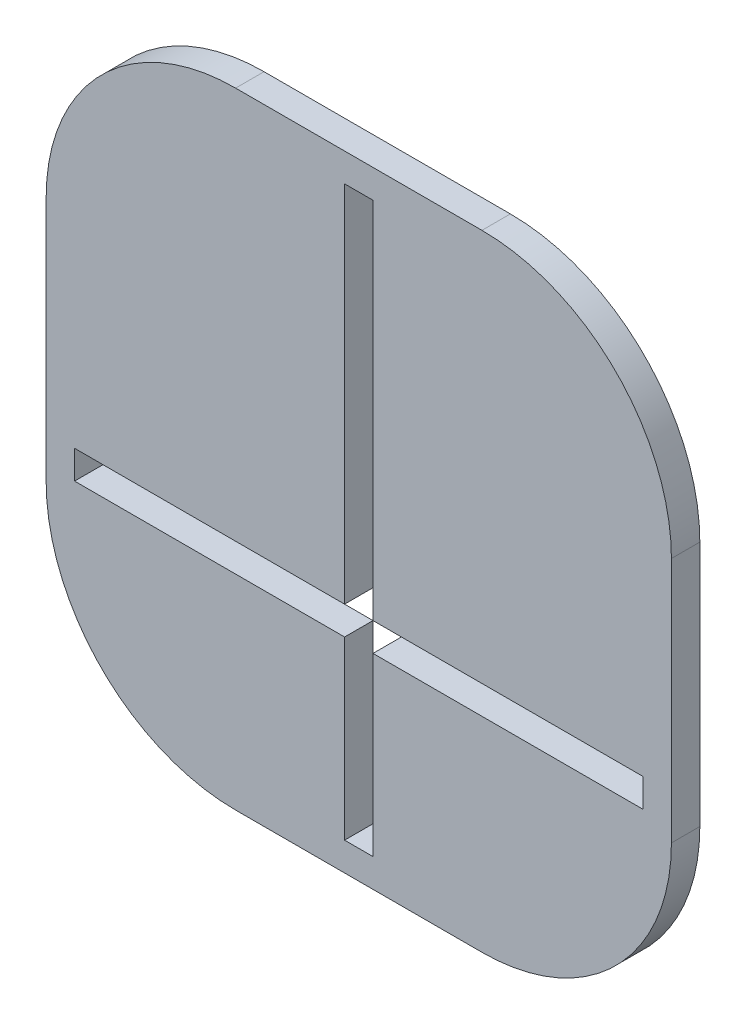
ISO-10303-21;
HEADER;
FILE_DESCRIPTION(('STEP AP214'),'2;1');
FILE_NAME('part.step','',(''),(''),'','','');
FILE_SCHEMA(('AUTOMOTIVE_DESIGN { 1 0 10303 214 1 1 1 1 }'));
ENDSEC;
DATA;
#1=APPLICATION_CONTEXT('core data for automotive mechanical design processes');
#2=APPLICATION_PROTOCOL_DEFINITION('international standard','automotive_design',2000,#1);
#3=PRODUCT_CONTEXT('',#1,'mechanical');
#4=PRODUCT('Part','Part','',(#3));
#5=PRODUCT_RELATED_PRODUCT_CATEGORY('part','',(#4));
#6=PRODUCT_DEFINITION_FORMATION('','',#4);
#7=PRODUCT_DEFINITION_CONTEXT('part definition',#1,'design');
#8=PRODUCT_DEFINITION('design','',#6,#7);
#9=PRODUCT_DEFINITION_SHAPE('','',#8);
#10=(LENGTH_UNIT() NAMED_UNIT(*) SI_UNIT(.MILLI.,.METRE.));
#11=(NAMED_UNIT(*) PLANE_ANGLE_UNIT() SI_UNIT($,.RADIAN.));
#12=(NAMED_UNIT(*) SI_UNIT($,.STERADIAN.) SOLID_ANGLE_UNIT());
#13=UNCERTAINTY_MEASURE_WITH_UNIT(LENGTH_MEASURE(1.E-05),#10,'distance_accuracy_value','');
#14=(GEOMETRIC_REPRESENTATION_CONTEXT(3) GLOBAL_UNCERTAINTY_ASSIGNED_CONTEXT((#13)) GLOBAL_UNIT_ASSIGNED_CONTEXT((#10,
#11,#12)) REPRESENTATION_CONTEXT('',''));
#15=CARTESIAN_POINT('',(0.,0.,0.));
#16=DIRECTION('',(0.,0.,1.));
#17=DIRECTION('',(1.,0.,0.));
#18=AXIS2_PLACEMENT_3D('',#15,#16,#17);
#19=CARTESIAN_POINT('',(0.,33.,3.));
#20=DIRECTION('',(0.,-1.,0.));
#21=DIRECTION('',(1.,0.,0.));
#22=AXIS2_PLACEMENT_3D('',#19,#20,#21);
#23=PLANE('',#22);
#24=DIRECTION('',(-1.,0.,0.));
#25=VECTOR('',#24,1.);
#26=CARTESIAN_POINT('',(0.,33.,0.));
#27=LINE('',#26,#25);
#28=CARTESIAN_POINT('',(12.9999999999999,33.,0.));
#29=VERTEX_POINT('',#28);
#30=CARTESIAN_POINT('',(-12.9999999999999,33.,0.));
#31=VERTEX_POINT('',#30);
#32=EDGE_CURVE('E238',#29,#31,#27,.T.);
#33=ORIENTED_EDGE('',*,*,#32,.T.);
#34=DIRECTION('',(0.,0.,-1.));
#35=VECTOR('',#34,1.);
#36=CARTESIAN_POINT('',(-12.9999999999999,33.,3.));
#37=LINE('',#36,#35);
#38=CARTESIAN_POINT('',(-12.9999999999999,33.,3.));
#39=VERTEX_POINT('',#38);
#40=EDGE_CURVE('E11',#39,#31,#37,.T.);
#41=ORIENTED_EDGE('',*,*,#40,.F.);
#42=DIRECTION('',(-1.,0.,0.));
#43=VECTOR('',#42,1.);
#44=CARTESIAN_POINT('',(0.,33.,3.));
#45=LINE('',#44,#43);
#46=CARTESIAN_POINT('',(12.9999999999999,33.,3.));
#47=VERTEX_POINT('',#46);
#48=EDGE_CURVE('E366',#47,#39,#45,.T.);
#49=ORIENTED_EDGE('',*,*,#48,.F.);
#50=DIRECTION('',(0.,0.,-1.));
#51=VECTOR('',#50,1.);
#52=CARTESIAN_POINT('',(12.9999999999999,33.,3.));
#53=LINE('',#52,#51);
#54=EDGE_CURVE('E257',#47,#29,#53,.T.);
#55=ORIENTED_EDGE('',*,*,#54,.T.);
#56=EDGE_LOOP('',(#33,#41,#49,#55));
#57=FACE_BOUND('',#56,.T.);
#58=ADVANCED_FACE('F42',(#57),#23,.F.);
#59=CARTESIAN_POINT('',(-13.,13.,3.));
#60=DIRECTION('',(0.,0.,-1.));
#61=DIRECTION('',(-1.,0.,0.));
#62=AXIS2_PLACEMENT_3D('',#59,#60,#61);
#63=CYLINDRICAL_SURFACE('',#62,20.);
#64=CARTESIAN_POINT('',(-13.,13.,0.));
#65=DIRECTION('',(0.,0.,1.));
#66=DIRECTION('',(1.,0.,0.));
#67=AXIS2_PLACEMENT_3D('',#64,#65,#66);
#68=CIRCLE('',#67,20.);
#69=CARTESIAN_POINT('',(-33.,12.9999999999998,0.));
#70=VERTEX_POINT('',#69);
#71=EDGE_CURVE('E241',#31,#70,#68,.T.);
#72=ORIENTED_EDGE('',*,*,#71,.T.);
#73=DIRECTION('',(0.,0.,-1.));
#74=VECTOR('',#73,1.);
#75=CARTESIAN_POINT('',(-33.,12.9999999999998,3.));
#76=LINE('',#75,#74);
#77=CARTESIAN_POINT('',(-33.,12.9999999999998,3.));
#78=VERTEX_POINT('',#77);
#79=EDGE_CURVE('E52',#78,#70,#76,.T.);
#80=ORIENTED_EDGE('',*,*,#79,.F.);
#81=CARTESIAN_POINT('',(-13.,13.,3.));
#82=DIRECTION('',(0.,0.,1.));
#83=DIRECTION('',(1.,0.,0.));
#84=AXIS2_PLACEMENT_3D('',#81,#82,#83);
#85=CIRCLE('',#84,20.);
#86=EDGE_CURVE('E373',#39,#78,#85,.T.);
#87=ORIENTED_EDGE('',*,*,#86,.F.);
#88=ORIENTED_EDGE('',*,*,#40,.T.);
#89=EDGE_LOOP('',(#72,#80,#87,#88));
#90=FACE_BOUND('',#89,.T.);
#91=ADVANCED_FACE('F400',(#90),#63,.T.);
#92=CARTESIAN_POINT('',(-33.,0.,3.));
#93=DIRECTION('',(-1.,0.,0.));
#94=DIRECTION('',(0.,0.,1.));
#95=AXIS2_PLACEMENT_3D('',#92,#93,#94);
#96=PLANE('',#95);
#97=DIRECTION('',(0.,1.,0.));
#98=VECTOR('',#97,1.);
#99=CARTESIAN_POINT('',(-33.,0.,0.));
#100=LINE('',#99,#98);
#101=CARTESIAN_POINT('',(-33.,-12.9999999999999,0.));
#102=VERTEX_POINT('',#101);
#103=EDGE_CURVE('E244',#102,#70,#100,.T.);
#104=ORIENTED_EDGE('',*,*,#103,.F.);
#105=DIRECTION('',(0.,0.,-1.));
#106=VECTOR('',#105,1.);
#107=CARTESIAN_POINT('',(-33.,-12.9999999999999,3.));
#108=LINE('',#107,#106);
#109=CARTESIAN_POINT('',(-33.,-12.9999999999999,3.));
#110=VERTEX_POINT('',#109);
#111=EDGE_CURVE('E263',#110,#102,#108,.T.);
#112=ORIENTED_EDGE('',*,*,#111,.F.);
#113=DIRECTION('',(0.,1.,0.));
#114=VECTOR('',#113,1.);
#115=CARTESIAN_POINT('',(-33.,0.,3.));
#116=LINE('',#115,#114);
#117=EDGE_CURVE('E375',#110,#78,#116,.T.);
#118=ORIENTED_EDGE('',*,*,#117,.T.);
#119=ORIENTED_EDGE('',*,*,#79,.T.);
#120=EDGE_LOOP('',(#104,#112,#118,#119));
#121=FACE_BOUND('',#120,.T.);
#122=ADVANCED_FACE('F405',(#121),#96,.T.);
#123=CARTESIAN_POINT('',(-13.,-13.,3.));
#124=DIRECTION('',(0.,0.,-1.));
#125=DIRECTION('',(-1.,0.,0.));
#126=AXIS2_PLACEMENT_3D('',#123,#124,#125);
#127=CYLINDRICAL_SURFACE('',#126,20.);
#128=CARTESIAN_POINT('',(-13.,-13.,0.));
#129=DIRECTION('',(0.,0.,1.));
#130=DIRECTION('',(1.,0.,0.));
#131=AXIS2_PLACEMENT_3D('',#128,#129,#130);
#132=CIRCLE('',#131,20.);
#133=CARTESIAN_POINT('',(-12.9999999999999,-33.,0.));
#134=VERTEX_POINT('',#133);
#135=EDGE_CURVE('E247',#134,#102,#132,.F.);
#136=ORIENTED_EDGE('',*,*,#135,.F.);
#137=DIRECTION('',(0.,0.,-1.));
#138=VECTOR('',#137,1.);
#139=CARTESIAN_POINT('',(-12.9999999999999,-33.,3.));
#140=LINE('',#139,#138);
#141=CARTESIAN_POINT('',(-12.9999999999999,-33.,3.));
#142=VERTEX_POINT('',#141);
#143=EDGE_CURVE('E261',#142,#134,#140,.T.);
#144=ORIENTED_EDGE('',*,*,#143,.F.);
#145=CARTESIAN_POINT('',(-13.,-13.,3.));
#146=DIRECTION('',(0.,0.,1.));
#147=DIRECTION('',(1.,0.,0.));
#148=AXIS2_PLACEMENT_3D('',#145,#146,#147);
#149=CIRCLE('',#148,20.);
#150=EDGE_CURVE('E378',#142,#110,#149,.F.);
#151=ORIENTED_EDGE('',*,*,#150,.T.);
#152=ORIENTED_EDGE('',*,*,#111,.T.);
#153=EDGE_LOOP('',(#136,#144,#151,#152));
#154=FACE_BOUND('',#153,.T.);
#155=ADVANCED_FACE('F440',(#154),#127,.T.);
#156=CARTESIAN_POINT('',(0.,-33.,3.));
#157=DIRECTION('',(0.,-1.,0.));
#158=DIRECTION('',(1.,0.,0.));
#159=AXIS2_PLACEMENT_3D('',#156,#157,#158);
#160=PLANE('',#159);
#161=DIRECTION('',(-1.,0.,0.));
#162=VECTOR('',#161,1.);
#163=CARTESIAN_POINT('',(0.,-33.,0.));
#164=LINE('',#163,#162);
#165=CARTESIAN_POINT('',(12.9999999999999,-33.,0.));
#166=VERTEX_POINT('',#165);
#167=EDGE_CURVE('E250',#166,#134,#164,.T.);
#168=ORIENTED_EDGE('',*,*,#167,.F.);
#169=DIRECTION('',(0.,0.,-1.));
#170=VECTOR('',#169,1.);
#171=CARTESIAN_POINT('',(12.9999999999999,-33.,3.));
#172=LINE('',#171,#170);
#173=CARTESIAN_POINT('',(12.9999999999999,-33.,3.));
#174=VERTEX_POINT('',#173);
#175=EDGE_CURVE('E206',#174,#166,#172,.T.);
#176=ORIENTED_EDGE('',*,*,#175,.F.);
#177=DIRECTION('',(-1.,0.,0.));
#178=VECTOR('',#177,1.);
#179=CARTESIAN_POINT('',(0.,-33.,3.));
#180=LINE('',#179,#178);
#181=EDGE_CURVE('E199',#174,#142,#180,.T.);
#182=ORIENTED_EDGE('',*,*,#181,.T.);
#183=ORIENTED_EDGE('',*,*,#143,.T.);
#184=EDGE_LOOP('',(#168,#176,#182,#183));
#185=FACE_BOUND('',#184,.T.);
#186=ADVANCED_FACE('F382',(#185),#160,.T.);
#187=CARTESIAN_POINT('',(13.,-13.,3.));
#188=DIRECTION('',(0.,0.,-1.));
#189=DIRECTION('',(-1.,0.,0.));
#190=AXIS2_PLACEMENT_3D('',#187,#188,#189);
#191=CYLINDRICAL_SURFACE('',#190,20.);
#192=CARTESIAN_POINT('',(13.,-13.,0.));
#193=DIRECTION('',(0.,0.,1.));
#194=DIRECTION('',(1.,0.,0.));
#195=AXIS2_PLACEMENT_3D('',#192,#193,#194);
#196=CIRCLE('',#195,20.);
#197=CARTESIAN_POINT('',(33.,-12.9999999999999,0.));
#198=VERTEX_POINT('',#197);
#199=EDGE_CURVE('E205',#166,#198,#196,.T.);
#200=ORIENTED_EDGE('',*,*,#199,.T.);
#201=DIRECTION('',(0.,0.,-1.));
#202=VECTOR('',#201,1.);
#203=CARTESIAN_POINT('',(33.,-12.9999999999999,3.));
#204=LINE('',#203,#202);
#205=CARTESIAN_POINT('',(33.,-12.9999999999999,3.));
#206=VERTEX_POINT('',#205);
#207=EDGE_CURVE('E202',#206,#198,#204,.T.);
#208=ORIENTED_EDGE('',*,*,#207,.F.);
#209=CARTESIAN_POINT('',(13.,-13.,3.));
#210=DIRECTION('',(0.,0.,1.));
#211=DIRECTION('',(1.,0.,0.));
#212=AXIS2_PLACEMENT_3D('',#209,#210,#211);
#213=CIRCLE('',#212,20.);
#214=EDGE_CURVE('E192',#174,#206,#213,.T.);
#215=ORIENTED_EDGE('',*,*,#214,.F.);
#216=ORIENTED_EDGE('',*,*,#175,.T.);
#217=EDGE_LOOP('',(#200,#208,#215,#216));
#218=FACE_BOUND('',#217,.T.);
#219=ADVANCED_FACE('F203',(#218),#191,.T.);
#220=CARTESIAN_POINT('',(33.,0.,3.));
#221=DIRECTION('',(-1.,0.,0.));
#222=DIRECTION('',(0.,0.,1.));
#223=AXIS2_PLACEMENT_3D('',#220,#221,#222);
#224=PLANE('',#223);
#225=DIRECTION('',(0.,1.,0.));
#226=VECTOR('',#225,1.);
#227=CARTESIAN_POINT('',(33.,0.,0.));
#228=LINE('',#227,#226);
#229=CARTESIAN_POINT('',(33.,12.9999999999999,0.));
#230=VERTEX_POINT('',#229);
#231=EDGE_CURVE('E126',#198,#230,#228,.T.);
#232=ORIENTED_EDGE('',*,*,#231,.T.);
#233=DIRECTION('',(0.,0.,-1.));
#234=VECTOR('',#233,1.);
#235=CARTESIAN_POINT('',(33.,12.9999999999999,3.));
#236=LINE('',#235,#234);
#237=CARTESIAN_POINT('',(33.,12.9999999999999,3.));
#238=VERTEX_POINT('',#237);
#239=EDGE_CURVE('E207',#238,#230,#236,.T.);
#240=ORIENTED_EDGE('',*,*,#239,.F.);
#241=DIRECTION('',(0.,1.,0.));
#242=VECTOR('',#241,1.);
#243=CARTESIAN_POINT('',(33.,0.,3.));
#244=LINE('',#243,#242);
#245=EDGE_CURVE('E196',#206,#238,#244,.T.);
#246=ORIENTED_EDGE('',*,*,#245,.F.);
#247=ORIENTED_EDGE('',*,*,#207,.T.);
#248=EDGE_LOOP('',(#232,#240,#246,#247));
#249=FACE_BOUND('',#248,.T.);
#250=ADVANCED_FACE('F209',(#249),#224,.F.);
#251=CARTESIAN_POINT('',(0.,30.,3.));
#252=DIRECTION('',(0.,1.,0.));
#253=DIRECTION('',(0.,0.,1.));
#254=AXIS2_PLACEMENT_3D('',#251,#252,#253);
#255=PLANE('',#254);
#256=DIRECTION('',(1.,0.,0.));
#257=VECTOR('',#256,1.);
#258=CARTESIAN_POINT('',(0.,30.,0.));
#259=LINE('',#258,#257);
#260=CARTESIAN_POINT('',(-1.50000000000001,30.,0.));
#261=VERTEX_POINT('',#260);
#262=CARTESIAN_POINT('',(1.50000000000001,30.,0.));
#263=VERTEX_POINT('',#262);
#264=EDGE_CURVE('E215',#261,#263,#259,.T.);
#265=ORIENTED_EDGE('',*,*,#264,.T.);
#266=DIRECTION('',(0.,0.,-1.));
#267=VECTOR('',#266,1.);
#268=CARTESIAN_POINT('',(1.50000000000001,30.,3.));
#269=LINE('',#268,#267);
#270=CARTESIAN_POINT('',(1.50000000000001,30.,3.));
#271=VERTEX_POINT('',#270);
#272=EDGE_CURVE('E46',#271,#263,#269,.T.);
#273=ORIENTED_EDGE('',*,*,#272,.F.);
#274=DIRECTION('',(1.,0.,0.));
#275=VECTOR('',#274,1.);
#276=CARTESIAN_POINT('',(0.,30.,3.));
#277=LINE('',#276,#275);
#278=CARTESIAN_POINT('',(-1.50000000000001,30.,3.));
#279=VERTEX_POINT('',#278);
#280=EDGE_CURVE('E256',#279,#271,#277,.T.);
#281=ORIENTED_EDGE('',*,*,#280,.F.);
#282=DIRECTION('',(0.,0.,-1.));
#283=VECTOR('',#282,1.);
#284=CARTESIAN_POINT('',(-1.50000000000001,30.,3.));
#285=LINE('',#284,#283);
#286=EDGE_CURVE('E211',#279,#261,#285,.T.);
#287=ORIENTED_EDGE('',*,*,#286,.T.);
#288=EDGE_LOOP('',(#265,#273,#281,#287));
#289=FACE_BOUND('',#288,.T.);
#290=ADVANCED_FACE('F44',(#289),#255,.F.);
#291=CARTESIAN_POINT('',(1.50000000000001,0.,3.));
#292=DIRECTION('',(1.,0.,0.));
#293=DIRECTION('',(0.,0.,-1.));
#294=AXIS2_PLACEMENT_3D('',#291,#292,#293);
#295=PLANE('',#294);
#296=DIRECTION('',(0.,-1.,0.));
#297=VECTOR('',#296,1.);
#298=CARTESIAN_POINT('',(1.50000000000001,0.,0.));
#299=LINE('',#298,#297);
#300=CARTESIAN_POINT('',(1.50000000000001,-8.42500000000001,0.));
#301=VERTEX_POINT('',#300);
#302=EDGE_CURVE('E218',#263,#301,#299,.T.);
#303=ORIENTED_EDGE('',*,*,#302,.T.);
#304=DIRECTION('',(0.,0.,-1.));
#305=VECTOR('',#304,1.);
#306=CARTESIAN_POINT('',(1.50000000000001,-8.42500000000001,3.));
#307=LINE('',#306,#305);
#308=CARTESIAN_POINT('',(1.50000000000001,-8.42500000000001,3.));
#309=VERTEX_POINT('',#308);
#310=EDGE_CURVE('E289',#309,#301,#307,.T.);
#311=ORIENTED_EDGE('',*,*,#310,.F.);
#312=DIRECTION('',(0.,-1.,0.));
#313=VECTOR('',#312,1.);
#314=CARTESIAN_POINT('',(1.50000000000001,0.,3.));
#315=LINE('',#314,#313);
#316=EDGE_CURVE('E141',#271,#309,#315,.T.);
#317=ORIENTED_EDGE('',*,*,#316,.F.);
#318=ORIENTED_EDGE('',*,*,#272,.T.);
#319=EDGE_LOOP('',(#303,#311,#317,#318));
#320=FACE_BOUND('',#319,.T.);
#321=ADVANCED_FACE('F295',(#320),#295,.F.);
#322=CARTESIAN_POINT('',(0.,-8.42500000000001,3.));
#323=DIRECTION('',(0.,1.,0.));
#324=DIRECTION('',(0.,0.,1.));
#325=AXIS2_PLACEMENT_3D('',#322,#323,#324);
#326=PLANE('',#325);
#327=DIRECTION('',(1.,0.,0.));
#328=VECTOR('',#327,1.);
#329=CARTESIAN_POINT('',(0.,-8.42500000000001,0.));
#330=LINE('',#329,#328);
#331=CARTESIAN_POINT('',(30.,-8.42500000000001,0.));
#332=VERTEX_POINT('',#331);
#333=EDGE_CURVE('E220',#301,#332,#330,.T.);
#334=ORIENTED_EDGE('',*,*,#333,.T.);
#335=DIRECTION('',(0.,0.,-1.));
#336=VECTOR('',#335,1.);
#337=CARTESIAN_POINT('',(30.,-8.42500000000001,3.));
#338=LINE('',#337,#336);
#339=CARTESIAN_POINT('',(30.,-8.42500000000001,3.));
#340=VERTEX_POINT('',#339);
#341=EDGE_CURVE('E287',#340,#332,#338,.T.);
#342=ORIENTED_EDGE('',*,*,#341,.F.);
#343=DIRECTION('',(1.,0.,0.));
#344=VECTOR('',#343,1.);
#345=CARTESIAN_POINT('',(0.,-8.42500000000001,3.));
#346=LINE('',#345,#344);
#347=EDGE_CURVE('E358',#309,#340,#346,.T.);
#348=ORIENTED_EDGE('',*,*,#347,.F.);
#349=ORIENTED_EDGE('',*,*,#310,.T.);
#350=EDGE_LOOP('',(#334,#342,#348,#349));
#351=FACE_BOUND('',#350,.T.);
#352=ADVANCED_FACE('F357',(#351),#326,.F.);
#353=CARTESIAN_POINT('',(30.,0.,3.));
#354=DIRECTION('',(1.,0.,0.));
#355=DIRECTION('',(0.,0.,-1.));
#356=AXIS2_PLACEMENT_3D('',#353,#354,#355);
#357=PLANE('',#356);
#358=DIRECTION('',(0.,-1.,0.));
#359=VECTOR('',#358,1.);
#360=CARTESIAN_POINT('',(30.,0.,0.));
#361=LINE('',#360,#359);
#362=CARTESIAN_POINT('',(30.,-11.425,0.));
#363=VERTEX_POINT('',#362);
#364=EDGE_CURVE('E223',#332,#363,#361,.T.);
#365=ORIENTED_EDGE('',*,*,#364,.T.);
#366=DIRECTION('',(0.,0.,-1.));
#367=VECTOR('',#366,1.);
#368=CARTESIAN_POINT('',(30.,-11.425,3.));
#369=LINE('',#368,#367);
#370=CARTESIAN_POINT('',(30.,-11.425,3.));
#371=VERTEX_POINT('',#370);
#372=EDGE_CURVE('E284',#371,#363,#369,.T.);
#373=ORIENTED_EDGE('',*,*,#372,.F.);
#374=DIRECTION('',(0.,-1.,0.));
#375=VECTOR('',#374,1.);
#376=CARTESIAN_POINT('',(30.,0.,3.));
#377=LINE('',#376,#375);
#378=EDGE_CURVE('E356',#340,#371,#377,.T.);
#379=ORIENTED_EDGE('',*,*,#378,.F.);
#380=ORIENTED_EDGE('',*,*,#341,.T.);
#381=EDGE_LOOP('',(#365,#373,#379,#380));
#382=FACE_BOUND('',#381,.T.);
#383=ADVANCED_FACE('F353',(#382),#357,.F.);
#384=CARTESIAN_POINT('',(0.,-11.425,3.));
#385=DIRECTION('',(0.,-1.,0.));
#386=DIRECTION('',(0.,0.,-1.));
#387=AXIS2_PLACEMENT_3D('',#384,#385,#386);
#388=PLANE('',#387);
#389=DIRECTION('',(-1.,0.,0.));
#390=VECTOR('',#389,1.);
#391=CARTESIAN_POINT('',(0.,-11.425,0.));
#392=LINE('',#391,#390);
#393=CARTESIAN_POINT('',(1.50000000000001,-11.425,0.));
#394=VERTEX_POINT('',#393);
#395=EDGE_CURVE('E226',#363,#394,#392,.T.);
#396=ORIENTED_EDGE('',*,*,#395,.T.);
#397=DIRECTION('',(0.,0.,-1.));
#398=VECTOR('',#397,1.);
#399=CARTESIAN_POINT('',(1.50000000000001,-11.425,3.));
#400=LINE('',#399,#398);
#401=CARTESIAN_POINT('',(1.50000000000001,-11.425,3.));
#402=VERTEX_POINT('',#401);
#403=EDGE_CURVE('E281',#402,#394,#400,.T.);
#404=ORIENTED_EDGE('',*,*,#403,.F.);
#405=DIRECTION('',(-1.,0.,0.));
#406=VECTOR('',#405,1.);
#407=CARTESIAN_POINT('',(0.,-11.425,3.));
#408=LINE('',#407,#406);
#409=EDGE_CURVE('E349',#371,#402,#408,.T.);
#410=ORIENTED_EDGE('',*,*,#409,.F.);
#411=ORIENTED_EDGE('',*,*,#372,.T.);
#412=EDGE_LOOP('',(#396,#404,#410,#411));
#413=FACE_BOUND('',#412,.T.);
#414=ADVANCED_FACE('F348',(#413),#388,.F.);
#415=CARTESIAN_POINT('',(1.50000000000001,-30.,0.));
#416=VERTEX_POINT('',#415);
#417=EDGE_CURVE('E221',#394,#416,#299,.T.);
#418=ORIENTED_EDGE('',*,*,#417,.T.);
#419=DIRECTION('',(0.,0.,-1.));
#420=VECTOR('',#419,1.);
#421=CARTESIAN_POINT('',(1.50000000000001,-30.,3.));
#422=LINE('',#421,#420);
#423=CARTESIAN_POINT('',(1.50000000000001,-30.,3.));
#424=VERTEX_POINT('',#423);
#425=EDGE_CURVE('E279',#424,#416,#422,.T.);
#426=ORIENTED_EDGE('',*,*,#425,.F.);
#427=EDGE_CURVE('E345',#402,#424,#315,.T.);
#428=ORIENTED_EDGE('',*,*,#427,.F.);
#429=ORIENTED_EDGE('',*,*,#403,.T.);
#430=EDGE_LOOP('',(#418,#426,#428,#429));
#431=FACE_BOUND('',#430,.T.);
#432=ADVANCED_FACE('F343',(#431),#295,.F.);
#433=CARTESIAN_POINT('',(0.,-30.,3.));
#434=DIRECTION('',(0.,1.,0.));
#435=DIRECTION('',(0.,0.,1.));
#436=AXIS2_PLACEMENT_3D('',#433,#434,#435);
#437=PLANE('',#436);
#438=DIRECTION('',(1.,0.,0.));
#439=VECTOR('',#438,1.);
#440=CARTESIAN_POINT('',(0.,-30.,0.));
#441=LINE('',#440,#439);
#442=CARTESIAN_POINT('',(-1.50000000000001,-30.,0.));
#443=VERTEX_POINT('',#442);
#444=EDGE_CURVE('E229',#443,#416,#441,.T.);
#445=ORIENTED_EDGE('',*,*,#444,.F.);
#446=DIRECTION('',(0.,0.,-1.));
#447=VECTOR('',#446,1.);
#448=CARTESIAN_POINT('',(-1.50000000000001,-30.,3.));
#449=LINE('',#448,#447);
#450=CARTESIAN_POINT('',(-1.50000000000001,-30.,3.));
#451=VERTEX_POINT('',#450);
#452=EDGE_CURVE('E277',#451,#443,#449,.T.);
#453=ORIENTED_EDGE('',*,*,#452,.F.);
#454=DIRECTION('',(1.,0.,0.));
#455=VECTOR('',#454,1.);
#456=CARTESIAN_POINT('',(0.,-30.,3.));
#457=LINE('',#456,#455);
#458=EDGE_CURVE('E340',#451,#424,#457,.T.);
#459=ORIENTED_EDGE('',*,*,#458,.T.);
#460=ORIENTED_EDGE('',*,*,#425,.T.);
#461=EDGE_LOOP('',(#445,#453,#459,#460));
#462=FACE_BOUND('',#461,.T.);
#463=ADVANCED_FACE('F336',(#462),#437,.T.);
#464=CARTESIAN_POINT('',(-1.50000000000001,0.,3.));
#465=DIRECTION('',(1.,0.,0.));
#466=DIRECTION('',(0.,0.,-1.));
#467=AXIS2_PLACEMENT_3D('',#464,#465,#466);
#468=PLANE('',#467);
#469=DIRECTION('',(0.,-1.,0.));
#470=VECTOR('',#469,1.);
#471=CARTESIAN_POINT('',(-1.50000000000001,0.,0.));
#472=LINE('',#471,#470);
#473=CARTESIAN_POINT('',(-1.50000000000001,-11.425,0.));
#474=VERTEX_POINT('',#473);
#475=EDGE_CURVE('E232',#474,#443,#472,.T.);
#476=ORIENTED_EDGE('',*,*,#475,.F.);
#477=DIRECTION('',(0.,0.,-1.));
#478=VECTOR('',#477,1.);
#479=CARTESIAN_POINT('',(-1.50000000000001,-11.425,3.));
#480=LINE('',#479,#478);
#481=CARTESIAN_POINT('',(-1.50000000000001,-11.425,3.));
#482=VERTEX_POINT('',#481);
#483=EDGE_CURVE('E275',#482,#474,#480,.T.);
#484=ORIENTED_EDGE('',*,*,#483,.F.);
#485=DIRECTION('',(0.,-1.,0.));
#486=VECTOR('',#485,1.);
#487=CARTESIAN_POINT('',(-1.50000000000001,0.,3.));
#488=LINE('',#487,#486);
#489=EDGE_CURVE('E330',#482,#451,#488,.T.);
#490=ORIENTED_EDGE('',*,*,#489,.T.);
#491=ORIENTED_EDGE('',*,*,#452,.T.);
#492=EDGE_LOOP('',(#476,#484,#490,#491));
#493=FACE_BOUND('',#492,.T.);
#494=ADVANCED_FACE('F329',(#493),#468,.T.);
#495=CARTESIAN_POINT('',(-30.,-11.425,0.));
#496=VERTEX_POINT('',#495);
#497=EDGE_CURVE('E228',#474,#496,#392,.T.);
#498=ORIENTED_EDGE('',*,*,#497,.T.);
#499=DIRECTION('',(0.,0.,-1.));
#500=VECTOR('',#499,1.);
#501=CARTESIAN_POINT('',(-30.,-11.425,3.));
#502=LINE('',#501,#500);
#503=CARTESIAN_POINT('',(-30.,-11.425,3.));
#504=VERTEX_POINT('',#503);
#505=EDGE_CURVE('E272',#504,#496,#502,.T.);
#506=ORIENTED_EDGE('',*,*,#505,.F.);
#507=EDGE_CURVE('E325',#482,#504,#408,.T.);
#508=ORIENTED_EDGE('',*,*,#507,.F.);
#509=ORIENTED_EDGE('',*,*,#483,.T.);
#510=EDGE_LOOP('',(#498,#506,#508,#509));
#511=FACE_BOUND('',#510,.T.);
#512=ADVANCED_FACE('F324',(#511),#388,.F.);
#513=CARTESIAN_POINT('',(-30.,0.,3.));
#514=DIRECTION('',(-1.,0.,0.));
#515=DIRECTION('',(0.,0.,1.));
#516=AXIS2_PLACEMENT_3D('',#513,#514,#515);
#517=PLANE('',#516);
#518=DIRECTION('',(0.,1.,0.));
#519=VECTOR('',#518,1.);
#520=CARTESIAN_POINT('',(-30.,0.,0.));
#521=LINE('',#520,#519);
#522=CARTESIAN_POINT('',(-30.,-8.42500000000001,0.));
#523=VERTEX_POINT('',#522);
#524=EDGE_CURVE('E236',#496,#523,#521,.T.);
#525=ORIENTED_EDGE('',*,*,#524,.T.);
#526=DIRECTION('',(0.,0.,-1.));
#527=VECTOR('',#526,1.);
#528=CARTESIAN_POINT('',(-30.,-8.42500000000001,3.));
#529=LINE('',#528,#527);
#530=CARTESIAN_POINT('',(-30.,-8.42500000000001,3.));
#531=VERTEX_POINT('',#530);
#532=EDGE_CURVE('E269',#531,#523,#529,.T.);
#533=ORIENTED_EDGE('',*,*,#532,.F.);
#534=DIRECTION('',(0.,1.,0.));
#535=VECTOR('',#534,1.);
#536=CARTESIAN_POINT('',(-30.,0.,3.));
#537=LINE('',#536,#535);
#538=EDGE_CURVE('E321',#504,#531,#537,.T.);
#539=ORIENTED_EDGE('',*,*,#538,.F.);
#540=ORIENTED_EDGE('',*,*,#505,.T.);
#541=EDGE_LOOP('',(#525,#533,#539,#540));
#542=FACE_BOUND('',#541,.T.);
#543=ADVANCED_FACE('F318',(#542),#517,.F.);
#544=CARTESIAN_POINT('',(-1.50000000000001,-8.42500000000001,0.));
#545=VERTEX_POINT('',#544);
#546=EDGE_CURVE('E224',#523,#545,#330,.T.);
#547=ORIENTED_EDGE('',*,*,#546,.T.);
#548=DIRECTION('',(0.,0.,-1.));
#549=VECTOR('',#548,1.);
#550=CARTESIAN_POINT('',(-1.50000000000001,-8.42500000000001,3.));
#551=LINE('',#550,#549);
#552=CARTESIAN_POINT('',(-1.50000000000001,-8.42500000000001,3.));
#553=VERTEX_POINT('',#552);
#554=EDGE_CURVE('E267',#553,#545,#551,.T.);
#555=ORIENTED_EDGE('',*,*,#554,.F.);
#556=EDGE_CURVE('E361',#531,#553,#346,.T.);
#557=ORIENTED_EDGE('',*,*,#556,.F.);
#558=ORIENTED_EDGE('',*,*,#532,.T.);
#559=EDGE_LOOP('',(#547,#555,#557,#558));
#560=FACE_BOUND('',#559,.T.);
#561=ADVANCED_FACE('F311',(#560),#326,.F.);
#562=EDGE_CURVE('E235',#261,#545,#472,.T.);
#563=ORIENTED_EDGE('',*,*,#562,.F.);
#564=ORIENTED_EDGE('',*,*,#286,.F.);
#565=EDGE_CURVE('E364',#279,#553,#488,.T.);
#566=ORIENTED_EDGE('',*,*,#565,.T.);
#567=ORIENTED_EDGE('',*,*,#554,.T.);
#568=EDGE_LOOP('',(#563,#564,#566,#567));
#569=FACE_BOUND('',#568,.T.);
#570=ADVANCED_FACE('F306',(#569),#468,.T.);
#571=CARTESIAN_POINT('',(13.,13.,3.));
#572=DIRECTION('',(0.,0.,-1.));
#573=DIRECTION('',(-1.,0.,0.));
#574=AXIS2_PLACEMENT_3D('',#571,#572,#573);
#575=CYLINDRICAL_SURFACE('',#574,20.);
#576=CARTESIAN_POINT('',(13.,13.,0.));
#577=DIRECTION('',(0.,0.,1.));
#578=DIRECTION('',(1.,0.,0.));
#579=AXIS2_PLACEMENT_3D('',#576,#577,#578);
#580=CIRCLE('',#579,20.);
#581=EDGE_CURVE('E132',#230,#29,#580,.T.);
#582=ORIENTED_EDGE('',*,*,#581,.T.);
#583=ORIENTED_EDGE('',*,*,#54,.F.);
#584=CARTESIAN_POINT('',(13.,13.,3.));
#585=DIRECTION('',(0.,0.,1.));
#586=DIRECTION('',(1.,0.,0.));
#587=AXIS2_PLACEMENT_3D('',#584,#585,#586);
#588=CIRCLE('',#587,20.);
#589=EDGE_CURVE('E61',#238,#47,#588,.T.);
#590=ORIENTED_EDGE('',*,*,#589,.F.);
#591=ORIENTED_EDGE('',*,*,#239,.T.);
#592=EDGE_LOOP('',(#582,#583,#590,#591));
#593=FACE_BOUND('',#592,.T.);
#594=ADVANCED_FACE('F388',(#593),#575,.T.);
#595=CARTESIAN_POINT('',(0.,0.,3.));
#596=DIRECTION('',(0.,0.,1.));
#597=DIRECTION('',(1.,0.,0.));
#598=AXIS2_PLACEMENT_3D('',#595,#596,#597);
#599=PLANE('',#598);
#600=ORIENTED_EDGE('',*,*,#280,.T.);
#601=ORIENTED_EDGE('',*,*,#316,.T.);
#602=ORIENTED_EDGE('',*,*,#347,.T.);
#603=ORIENTED_EDGE('',*,*,#378,.T.);
#604=ORIENTED_EDGE('',*,*,#409,.T.);
#605=ORIENTED_EDGE('',*,*,#427,.T.);
#606=ORIENTED_EDGE('',*,*,#458,.F.);
#607=ORIENTED_EDGE('',*,*,#489,.F.);
#608=ORIENTED_EDGE('',*,*,#507,.T.);
#609=ORIENTED_EDGE('',*,*,#538,.T.);
#610=ORIENTED_EDGE('',*,*,#556,.T.);
#611=ORIENTED_EDGE('',*,*,#565,.F.);
#612=EDGE_LOOP('',(#600,#601,#602,#603,#604,#605,#606,#607,#608,#609,#610,#611));
#613=FACE_BOUND('',#612,.T.);
#614=ORIENTED_EDGE('',*,*,#48,.T.);
#615=ORIENTED_EDGE('',*,*,#86,.T.);
#616=ORIENTED_EDGE('',*,*,#117,.F.);
#617=ORIENTED_EDGE('',*,*,#150,.F.);
#618=ORIENTED_EDGE('',*,*,#181,.F.);
#619=ORIENTED_EDGE('',*,*,#214,.T.);
#620=ORIENTED_EDGE('',*,*,#245,.T.);
#621=ORIENTED_EDGE('',*,*,#589,.T.);
#622=EDGE_LOOP('',(#614,#615,#616,#617,#618,#619,#620,#621));
#623=FACE_BOUND('',#622,.T.);
#624=ADVANCED_FACE('F194',(#613,#623),#599,.T.);
#625=CARTESIAN_POINT('',(0.,0.,0.));
#626=DIRECTION('',(0.,0.,1.));
#627=DIRECTION('',(1.,0.,0.));
#628=AXIS2_PLACEMENT_3D('',#625,#626,#627);
#629=PLANE('',#628);
#630=ORIENTED_EDGE('',*,*,#264,.F.);
#631=ORIENTED_EDGE('',*,*,#562,.T.);
#632=ORIENTED_EDGE('',*,*,#546,.F.);
#633=ORIENTED_EDGE('',*,*,#524,.F.);
#634=ORIENTED_EDGE('',*,*,#497,.F.);
#635=ORIENTED_EDGE('',*,*,#475,.T.);
#636=ORIENTED_EDGE('',*,*,#444,.T.);
#637=ORIENTED_EDGE('',*,*,#417,.F.);
#638=ORIENTED_EDGE('',*,*,#395,.F.);
#639=ORIENTED_EDGE('',*,*,#364,.F.);
#640=ORIENTED_EDGE('',*,*,#333,.F.);
#641=ORIENTED_EDGE('',*,*,#302,.F.);
#642=EDGE_LOOP('',(#630,#631,#632,#633,#634,#635,#636,#637,#638,#639,#640,#641));
#643=FACE_BOUND('',#642,.T.);
#644=ORIENTED_EDGE('',*,*,#32,.F.);
#645=ORIENTED_EDGE('',*,*,#581,.F.);
#646=ORIENTED_EDGE('',*,*,#231,.F.);
#647=ORIENTED_EDGE('',*,*,#199,.F.);
#648=ORIENTED_EDGE('',*,*,#167,.T.);
#649=ORIENTED_EDGE('',*,*,#135,.T.);
#650=ORIENTED_EDGE('',*,*,#103,.T.);
#651=ORIENTED_EDGE('',*,*,#71,.F.);
#652=EDGE_LOOP('',(#644,#645,#646,#647,#648,#649,#650,#651));
#653=FACE_BOUND('',#652,.T.);
#654=ADVANCED_FACE('F302',(#643,#653),#629,.F.);
#655=CLOSED_SHELL('',(#58,#91,#122,#155,#186,#219,#250,#290,#321,#352,#383,#414,#432,#463,#494,
#512,#543,#561,#570,#594,#624,#654));
#656=MANIFOLD_SOLID_BREP('B2',#655);
#657=ADVANCED_BREP_SHAPE_REPRESENTATION('',(#18,#656),#14);
#658=SHAPE_DEFINITION_REPRESENTATION(#9,#657);
ENDSEC;
END-ISO-10303-21;
